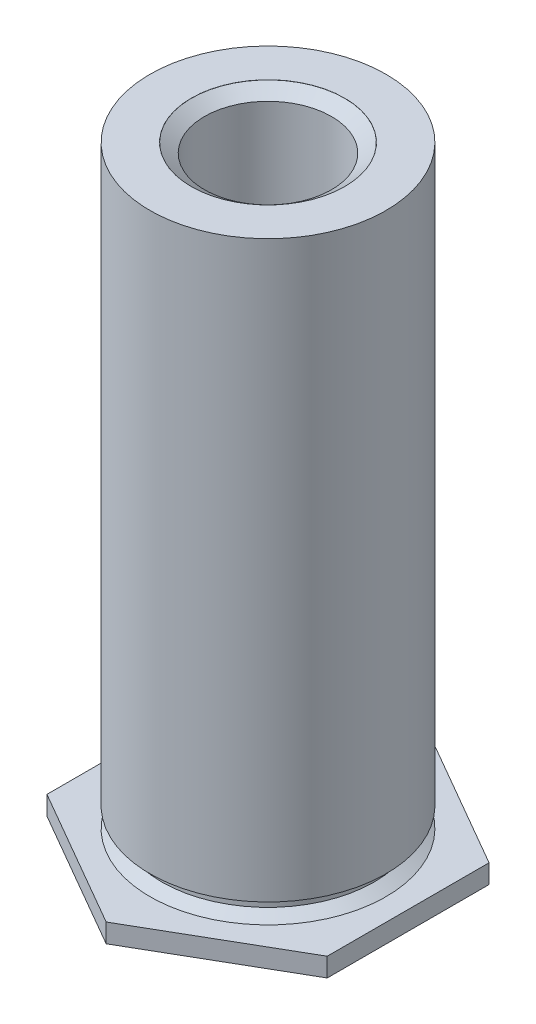
ISO-10303-21;
HEADER;
FILE_DESCRIPTION(('STEP AP214'),'2;1');
FILE_NAME('part.step','',(''),(''),'','','');
FILE_SCHEMA(('AUTOMOTIVE_DESIGN { 1 0 10303 214 1 1 1 1 }'));
ENDSEC;
DATA;
#1=APPLICATION_CONTEXT('core data for automotive mechanical design processes');
#2=APPLICATION_PROTOCOL_DEFINITION('international standard','automotive_design',2000,#1);
#3=PRODUCT_CONTEXT('',#1,'mechanical');
#4=PRODUCT('Part','Part','',(#3));
#5=PRODUCT_RELATED_PRODUCT_CATEGORY('part','',(#4));
#6=PRODUCT_DEFINITION_FORMATION('','',#4);
#7=PRODUCT_DEFINITION_CONTEXT('part definition',#1,'design');
#8=PRODUCT_DEFINITION('design','',#6,#7);
#9=PRODUCT_DEFINITION_SHAPE('','',#8);
#10=(LENGTH_UNIT() NAMED_UNIT(*) SI_UNIT(.MILLI.,.METRE.));
#11=(NAMED_UNIT(*) PLANE_ANGLE_UNIT() SI_UNIT($,.RADIAN.));
#12=(NAMED_UNIT(*) SI_UNIT($,.STERADIAN.) SOLID_ANGLE_UNIT());
#13=UNCERTAINTY_MEASURE_WITH_UNIT(LENGTH_MEASURE(1.E-05),#10,'distance_accuracy_value','');
#14=(GEOMETRIC_REPRESENTATION_CONTEXT(3) GLOBAL_UNCERTAINTY_ASSIGNED_CONTEXT((#13)) GLOBAL_UNIT_ASSIGNED_CONTEXT((#10,
#11,#12)) REPRESENTATION_CONTEXT('',''));
#15=CARTESIAN_POINT('',(0.,0.,0.));
#16=DIRECTION('',(0.,0.,1.));
#17=DIRECTION('',(1.,0.,0.));
#18=AXIS2_PLACEMENT_3D('',#15,#16,#17);
#19=CARTESIAN_POINT('',(3.712,0.4312,0.));
#20=DIRECTION('',(0.,1.,0.));
#21=DIRECTION('',(0.,0.,1.));
#22=AXIS2_PLACEMENT_3D('',#19,#20,#21);
#23=PLANE('',#22);
#24=CARTESIAN_POINT('',(0.,0.4312,0.));
#25=DIRECTION('',(0.,-1.,0.));
#26=DIRECTION('',(0.,0.,-1.));
#27=AXIS2_PLACEMENT_3D('',#24,#25,#26);
#28=CIRCLE('',#27,2.695);
#29=CARTESIAN_POINT('',(0.,0.4312,-2.695));
#30=VERTEX_POINT('',#29);
#31=EDGE_CURVE('E11',#30,#30,#28,.T.);
#32=ORIENTED_EDGE('',*,*,#31,.T.);
#33=EDGE_LOOP('',(#32));
#34=FACE_BOUND('',#33,.T.);
#35=DIRECTION('',(0.866025403784439,0.,0.5));
#36=VECTOR('',#35,1.);
#37=CARTESIAN_POINT('',(0.,0.4312,3.69504172281361));
#38=LINE('',#37,#36);
#39=CARTESIAN_POINT('',(-3.2,0.4312,1.8475208614068));
#40=VERTEX_POINT('',#39);
#41=CARTESIAN_POINT('',(0.,0.4312,3.69504172281361));
#42=VERTEX_POINT('',#41);
#43=EDGE_CURVE('E130',#40,#42,#38,.T.);
#44=ORIENTED_EDGE('',*,*,#43,.T.);
#45=DIRECTION('',(0.866025403784439,0.,-0.5));
#46=VECTOR('',#45,1.);
#47=CARTESIAN_POINT('',(3.2,0.4312,1.8475208614068));
#48=LINE('',#47,#46);
#49=CARTESIAN_POINT('',(3.2,0.4312,1.8475208614068));
#50=VERTEX_POINT('',#49);
#51=EDGE_CURVE('E119',#42,#50,#48,.T.);
#52=ORIENTED_EDGE('',*,*,#51,.T.);
#53=DIRECTION('',(0.,0.,-1.));
#54=VECTOR('',#53,1.);
#55=CARTESIAN_POINT('',(3.2,0.4312,-1.8475208614068));
#56=LINE('',#55,#54);
#57=CARTESIAN_POINT('',(3.2,0.4312,-1.8475208614068));
#58=VERTEX_POINT('',#57);
#59=EDGE_CURVE('E122',#50,#58,#56,.T.);
#60=ORIENTED_EDGE('',*,*,#59,.T.);
#61=DIRECTION('',(-0.866025403784439,0.,-0.5));
#62=VECTOR('',#61,1.);
#63=CARTESIAN_POINT('',(0.,0.4312,-3.69504172281361));
#64=LINE('',#63,#62);
#65=CARTESIAN_POINT('',(0.,0.4312,-3.69504172281361));
#66=VERTEX_POINT('',#65);
#67=EDGE_CURVE('E47',#58,#66,#64,.T.);
#68=ORIENTED_EDGE('',*,*,#67,.T.);
#69=DIRECTION('',(-0.866025403784438,0.,0.5));
#70=VECTOR('',#69,1.);
#71=CARTESIAN_POINT('',(-3.2,0.4312,-1.8475208614068));
#72=LINE('',#71,#70);
#73=CARTESIAN_POINT('',(-3.2,0.4312,-1.8475208614068));
#74=VERTEX_POINT('',#73);
#75=EDGE_CURVE('E95',#66,#74,#72,.T.);
#76=ORIENTED_EDGE('',*,*,#75,.T.);
#77=DIRECTION('',(0.,0.,1.));
#78=VECTOR('',#77,1.);
#79=CARTESIAN_POINT('',(-3.2,0.4312,1.8475208614068));
#80=LINE('',#79,#78);
#81=EDGE_CURVE('E127',#74,#40,#80,.T.);
#82=ORIENTED_EDGE('',*,*,#81,.T.);
#83=EDGE_LOOP('',(#44,#52,#60,#68,#76,#82));
#84=FACE_BOUND('',#83,.T.);
#85=ADVANCED_FACE('F32',(#34,#84),#23,.T.);
#86=CARTESIAN_POINT('',(0.,0.4312,0.));
#87=DIRECTION('',(0.,-1.,0.));
#88=DIRECTION('',(0.,0.,-1.));
#89=AXIS2_PLACEMENT_3D('',#86,#87,#88);
#90=CONICAL_SURFACE('',#89,2.695,1.0471975511966);
#91=CARTESIAN_POINT('',(0.,0.586795897546605,0.));
#92=DIRECTION('',(0.,-1.,0.));
#93=DIRECTION('',(0.,0.,-1.));
#94=AXIS2_PLACEMENT_3D('',#91,#92,#93);
#95=CIRCLE('',#94,2.4255);
#96=CARTESIAN_POINT('',(0.,0.586795897546605,-2.4255));
#97=VERTEX_POINT('',#96);
#98=EDGE_CURVE('E40',#97,#97,#95,.T.);
#99=ORIENTED_EDGE('',*,*,#98,.T.);
#100=EDGE_LOOP('',(#99));
#101=FACE_BOUND('',#100,.T.);
#102=ORIENTED_EDGE('',*,*,#31,.F.);
#103=EDGE_LOOP('',(#102));
#104=FACE_BOUND('',#103,.T.);
#105=ADVANCED_FACE('F170',(#101,#104),#90,.T.);
#106=CARTESIAN_POINT('',(0.,0.,0.));
#107=DIRECTION('',(0.,-1.,0.));
#108=DIRECTION('',(0.,0.,-1.));
#109=AXIS2_PLACEMENT_3D('',#106,#107,#108);
#110=CYLINDRICAL_SURFACE('',#109,2.4255);
#111=CARTESIAN_POINT('',(0.,0.88396,0.));
#112=DIRECTION('',(0.,-1.,0.));
#113=DIRECTION('',(0.,0.,-1.));
#114=AXIS2_PLACEMENT_3D('',#111,#112,#113);
#115=CIRCLE('',#114,2.4255);
#116=CARTESIAN_POINT('',(0.,0.88396,-2.4255));
#117=VERTEX_POINT('',#116);
#118=EDGE_CURVE('E164',#117,#117,#115,.T.);
#119=ORIENTED_EDGE('',*,*,#118,.T.);
#120=EDGE_LOOP('',(#119));
#121=FACE_BOUND('',#120,.T.);
#122=ORIENTED_EDGE('',*,*,#98,.F.);
#123=EDGE_LOOP('',(#122));
#124=FACE_BOUND('',#123,.T.);
#125=ADVANCED_FACE('F173',(#121,#124),#110,.T.);
#126=CARTESIAN_POINT('',(2.695,0.88396,0.));
#127=DIRECTION('',(0.,-1.,0.));
#128=DIRECTION('',(0.,0.,-1.));
#129=AXIS2_PLACEMENT_3D('',#126,#127,#128);
#130=PLANE('',#129);
#131=CARTESIAN_POINT('',(0.,0.88396,0.));
#132=DIRECTION('',(0.,-1.,0.));
#133=DIRECTION('',(0.,0.,-1.));
#134=AXIS2_PLACEMENT_3D('',#131,#132,#133);
#135=CIRCLE('',#134,2.695);
#136=CARTESIAN_POINT('',(0.,0.88396,-2.695));
#137=VERTEX_POINT('',#136);
#138=EDGE_CURVE('E161',#137,#137,#135,.T.);
#139=ORIENTED_EDGE('',*,*,#138,.T.);
#140=EDGE_LOOP('',(#139));
#141=FACE_BOUND('',#140,.T.);
#142=ORIENTED_EDGE('',*,*,#118,.F.);
#143=EDGE_LOOP('',(#142));
#144=FACE_BOUND('',#143,.T.);
#145=ADVANCED_FACE('F175',(#141,#144),#130,.T.);
#146=CARTESIAN_POINT('',(0.,0.,0.));
#147=DIRECTION('',(0.,-1.,0.));
#148=DIRECTION('',(0.,0.,-1.));
#149=AXIS2_PLACEMENT_3D('',#146,#147,#148);
#150=CYLINDRICAL_SURFACE('',#149,2.695);
#151=CARTESIAN_POINT('',(0.,14.,0.));
#152=DIRECTION('',(0.,-1.,0.));
#153=DIRECTION('',(0.,0.,-1.));
#154=AXIS2_PLACEMENT_3D('',#151,#152,#153);
#155=CIRCLE('',#154,2.695);
#156=CARTESIAN_POINT('',(0.,14.,-2.695));
#157=VERTEX_POINT('',#156);
#158=EDGE_CURVE('E158',#157,#157,#155,.T.);
#159=ORIENTED_EDGE('',*,*,#158,.T.);
#160=EDGE_LOOP('',(#159));
#161=FACE_BOUND('',#160,.T.);
#162=ORIENTED_EDGE('',*,*,#138,.F.);
#163=EDGE_LOOP('',(#162));
#164=FACE_BOUND('',#163,.T.);
#165=ADVANCED_FACE('F182',(#161,#164),#150,.T.);
#166=CARTESIAN_POINT('',(2.695,14.,0.));
#167=DIRECTION('',(0.,1.,0.));
#168=DIRECTION('',(0.,0.,1.));
#169=AXIS2_PLACEMENT_3D('',#166,#167,#168);
#170=PLANE('',#169);
#171=CARTESIAN_POINT('',(0.,14.,0.));
#172=DIRECTION('',(0.,1.,0.));
#173=DIRECTION('',(0.,0.,1.));
#174=AXIS2_PLACEMENT_3D('',#171,#172,#173);
#175=CIRCLE('',#174,1.7515);
#176=CARTESIAN_POINT('',(0.,14.,1.7515));
#177=VERTEX_POINT('',#176);
#178=EDGE_CURVE('E35',#177,#177,#175,.T.);
#179=ORIENTED_EDGE('',*,*,#178,.F.);
#180=EDGE_LOOP('',(#179));
#181=FACE_BOUND('',#180,.T.);
#182=ORIENTED_EDGE('',*,*,#158,.F.);
#183=EDGE_LOOP('',(#182));
#184=FACE_BOUND('',#183,.T.);
#185=ADVANCED_FACE('F229',(#181,#184),#170,.T.);
#186=CARTESIAN_POINT('',(1.7515,13.99746,0.));
#187=DIRECTION('',(0.,-1.,0.));
#188=DIRECTION('',(0.,0.,-1.));
#189=AXIS2_PLACEMENT_3D('',#186,#187,#188);
#190=PLANE('',#189);
#191=CARTESIAN_POINT('',(0.,13.99746,0.));
#192=DIRECTION('',(0.,-1.,0.));
#193=DIRECTION('',(0.,0.,-1.));
#194=AXIS2_PLACEMENT_3D('',#191,#192,#193);
#195=CIRCLE('',#194,1.7515);
#196=CARTESIAN_POINT('',(0.,13.99746,-1.7515));
#197=VERTEX_POINT('',#196);
#198=EDGE_CURVE('E135',#197,#197,#195,.T.);
#199=ORIENTED_EDGE('',*,*,#198,.F.);
#200=EDGE_LOOP('',(#199));
#201=FACE_BOUND('',#200,.T.);
#202=CARTESIAN_POINT('',(0.,13.99746,0.));
#203=DIRECTION('',(0.,-1.,0.));
#204=DIRECTION('',(0.,0.,-1.));
#205=AXIS2_PLACEMENT_3D('',#202,#203,#204);
#206=CIRCLE('',#205,1.75);
#207=CARTESIAN_POINT('',(0.,13.99746,-1.75));
#208=VERTEX_POINT('',#207);
#209=EDGE_CURVE('E146',#208,#208,#206,.T.);
#210=ORIENTED_EDGE('',*,*,#209,.T.);
#211=EDGE_LOOP('',(#210));
#212=FACE_BOUND('',#211,.T.);
#213=ADVANCED_FACE('F225',(#201,#212),#190,.F.);
#214=CARTESIAN_POINT('',(0.,13.787475760436,0.));
#215=DIRECTION('',(0.,1.,0.));
#216=DIRECTION('',(0.,0.,1.));
#217=AXIS2_PLACEMENT_3D('',#214,#215,#216);
#218=CONICAL_SURFACE('',#217,1.45,0.960105621522081);
#219=ORIENTED_EDGE('',*,*,#209,.F.);
#220=EDGE_LOOP('',(#219));
#221=FACE_BOUND('',#220,.T.);
#222=CARTESIAN_POINT('',(0.,13.787475760436,0.));
#223=DIRECTION('',(0.,-1.,0.));
#224=DIRECTION('',(0.,0.,-1.));
#225=AXIS2_PLACEMENT_3D('',#222,#223,#224);
#226=CIRCLE('',#225,1.45);
#227=CARTESIAN_POINT('',(0.,13.787475760436,-1.45));
#228=VERTEX_POINT('',#227);
#229=EDGE_CURVE('E143',#228,#228,#226,.T.);
#230=ORIENTED_EDGE('',*,*,#229,.T.);
#231=EDGE_LOOP('',(#230));
#232=FACE_BOUND('',#231,.T.);
#233=ADVANCED_FACE('F221',(#221,#232),#218,.F.);
#234=CARTESIAN_POINT('',(0.,-2.54,0.));
#235=DIRECTION('',(0.,-1.,0.));
#236=DIRECTION('',(0.,0.,-1.));
#237=AXIS2_PLACEMENT_3D('',#234,#235,#236);
#238=CYLINDRICAL_SURFACE('',#237,1.7515);
#239=ORIENTED_EDGE('',*,*,#178,.T.);
#240=EDGE_LOOP('',(#239));
#241=FACE_BOUND('',#240,.T.);
#242=ORIENTED_EDGE('',*,*,#198,.T.);
#243=EDGE_LOOP('',(#242));
#244=FACE_BOUND('',#243,.T.);
#245=ADVANCED_FACE('F217',(#241,#244),#238,.F.);
#246=CARTESIAN_POINT('',(0.,3.39939033455901,0.));
#247=DIRECTION('',(0.,1.,0.));
#248=DIRECTION('',(0.,0.,1.));
#249=AXIS2_PLACEMENT_3D('',#246,#247,#248);
#250=CONICAL_SURFACE('',#249,0.,1.17809724509617);
#251=CARTESIAN_POINT('',(0.,4.,0.));
#252=DIRECTION('',(0.,-1.,0.));
#253=DIRECTION('',(0.,0.,-1.));
#254=AXIS2_PLACEMENT_3D('',#251,#252,#253);
#255=CIRCLE('',#254,1.45);
#256=CARTESIAN_POINT('',(0.,4.,-1.45));
#257=VERTEX_POINT('',#256);
#258=EDGE_CURVE('E149',#257,#257,#255,.T.);
#259=ORIENTED_EDGE('',*,*,#258,.F.);
#260=EDGE_LOOP('',(#259));
#261=FACE_BOUND('',#260,.T.);
#262=CARTESIAN_POINT('',(0.,3.39939033455901,0.));
#263=VERTEX_POINT('',#262);
#264=VERTEX_LOOP('',#263);
#265=FACE_BOUND('',#264,.T.);
#266=ADVANCED_FACE('F220',(#261,#265),#250,.F.);
#267=CARTESIAN_POINT('',(0.,0.,0.));
#268=DIRECTION('',(0.,-1.,0.));
#269=DIRECTION('',(0.,0.,-1.));
#270=AXIS2_PLACEMENT_3D('',#267,#268,#269);
#271=CYLINDRICAL_SURFACE('',#270,1.45);
#272=ORIENTED_EDGE('',*,*,#229,.F.);
#273=EDGE_LOOP('',(#272));
#274=FACE_BOUND('',#273,.T.);
#275=ORIENTED_EDGE('',*,*,#258,.T.);
#276=EDGE_LOOP('',(#275));
#277=FACE_BOUND('',#276,.T.);
#278=ADVANCED_FACE('F216',(#274,#277),#271,.F.);
#279=CARTESIAN_POINT('',(3.2,0.,1.8475208614068));
#280=DIRECTION('',(0.5,0.,0.866025403784438));
#281=DIRECTION('',(0.866025403784439,0.,-0.5));
#282=AXIS2_PLACEMENT_3D('',#279,#280,#281);
#283=PLANE('',#282);
#284=ORIENTED_EDGE('',*,*,#51,.F.);
#285=DIRECTION('',(0.,1.,0.));
#286=VECTOR('',#285,1.);
#287=CARTESIAN_POINT('',(0.,0.,3.69504172281361));
#288=LINE('',#287,#286);
#289=CARTESIAN_POINT('',(0.,0.,3.69504172281361));
#290=VERTEX_POINT('',#289);
#291=EDGE_CURVE('E133',#290,#42,#288,.T.);
#292=ORIENTED_EDGE('',*,*,#291,.F.);
#293=DIRECTION('',(0.866025403784439,0.,-0.5));
#294=VECTOR('',#293,1.);
#295=CARTESIAN_POINT('',(3.2,0.,1.8475208614068));
#296=LINE('',#295,#294);
#297=CARTESIAN_POINT('',(3.2,0.,1.8475208614068));
#298=VERTEX_POINT('',#297);
#299=EDGE_CURVE('E55',#290,#298,#296,.T.);
#300=ORIENTED_EDGE('',*,*,#299,.T.);
#301=DIRECTION('',(0.,1.,0.));
#302=VECTOR('',#301,1.);
#303=CARTESIAN_POINT('',(3.2,0.,1.8475208614068));
#304=LINE('',#303,#302);
#305=EDGE_CURVE('E118',#298,#50,#304,.T.);
#306=ORIENTED_EDGE('',*,*,#305,.T.);
#307=EDGE_LOOP('',(#284,#292,#300,#306));
#308=FACE_BOUND('',#307,.T.);
#309=ADVANCED_FACE('F196',(#308),#283,.T.);
#310=CARTESIAN_POINT('',(0.,0.,3.69504172281361));
#311=DIRECTION('',(-0.5,0.,0.866025403784438));
#312=DIRECTION('',(0.866025403784439,0.,0.5));
#313=AXIS2_PLACEMENT_3D('',#310,#311,#312);
#314=PLANE('',#313);
#315=ORIENTED_EDGE('',*,*,#43,.F.);
#316=DIRECTION('',(0.,1.,0.));
#317=VECTOR('',#316,1.);
#318=CARTESIAN_POINT('',(-3.2,0.,1.8475208614068));
#319=LINE('',#318,#317);
#320=CARTESIAN_POINT('',(-3.2,0.,1.8475208614068));
#321=VERTEX_POINT('',#320);
#322=EDGE_CURVE('E136',#321,#40,#319,.T.);
#323=ORIENTED_EDGE('',*,*,#322,.F.);
#324=DIRECTION('',(0.866025403784439,0.,0.5));
#325=VECTOR('',#324,1.);
#326=CARTESIAN_POINT('',(0.,0.,3.69504172281361));
#327=LINE('',#326,#325);
#328=EDGE_CURVE('E112',#321,#290,#327,.T.);
#329=ORIENTED_EDGE('',*,*,#328,.T.);
#330=ORIENTED_EDGE('',*,*,#291,.T.);
#331=EDGE_LOOP('',(#315,#323,#329,#330));
#332=FACE_BOUND('',#331,.T.);
#333=ADVANCED_FACE('F195',(#332),#314,.T.);
#334=CARTESIAN_POINT('',(-3.2,0.,1.8475208614068));
#335=DIRECTION('',(-1.,0.,0.));
#336=DIRECTION('',(0.,0.,1.));
#337=AXIS2_PLACEMENT_3D('',#334,#335,#336);
#338=PLANE('',#337);
#339=ORIENTED_EDGE('',*,*,#81,.F.);
#340=DIRECTION('',(0.,1.,0.));
#341=VECTOR('',#340,1.);
#342=CARTESIAN_POINT('',(-3.2,0.,-1.8475208614068));
#343=LINE('',#342,#341);
#344=CARTESIAN_POINT('',(-3.2,0.,-1.8475208614068));
#345=VERTEX_POINT('',#344);
#346=EDGE_CURVE('E96',#345,#74,#343,.T.);
#347=ORIENTED_EDGE('',*,*,#346,.F.);
#348=DIRECTION('',(0.,0.,1.));
#349=VECTOR('',#348,1.);
#350=CARTESIAN_POINT('',(-3.2,0.,1.8475208614068));
#351=LINE('',#350,#349);
#352=EDGE_CURVE('E110',#345,#321,#351,.T.);
#353=ORIENTED_EDGE('',*,*,#352,.T.);
#354=ORIENTED_EDGE('',*,*,#322,.T.);
#355=EDGE_LOOP('',(#339,#347,#353,#354));
#356=FACE_BOUND('',#355,.T.);
#357=ADVANCED_FACE('F294',(#356),#338,.T.);
#358=CARTESIAN_POINT('',(-3.2,0.,-1.8475208614068));
#359=DIRECTION('',(-0.5,0.,-0.866025403784439));
#360=DIRECTION('',(-0.866025403784439,0.,0.5));
#361=AXIS2_PLACEMENT_3D('',#358,#359,#360);
#362=PLANE('',#361);
#363=ORIENTED_EDGE('',*,*,#75,.F.);
#364=DIRECTION('',(0.,1.,0.));
#365=VECTOR('',#364,1.);
#366=CARTESIAN_POINT('',(0.,0.,-3.69504172281361));
#367=LINE('',#366,#365);
#368=CARTESIAN_POINT('',(0.,0.,-3.69504172281361));
#369=VERTEX_POINT('',#368);
#370=EDGE_CURVE('E88',#369,#66,#367,.T.);
#371=ORIENTED_EDGE('',*,*,#370,.F.);
#372=DIRECTION('',(-0.866025403784438,0.,0.5));
#373=VECTOR('',#372,1.);
#374=CARTESIAN_POINT('',(-3.2,0.,-1.8475208614068));
#375=LINE('',#374,#373);
#376=EDGE_CURVE('E92',#369,#345,#375,.T.);
#377=ORIENTED_EDGE('',*,*,#376,.T.);
#378=ORIENTED_EDGE('',*,*,#346,.T.);
#379=EDGE_LOOP('',(#363,#371,#377,#378));
#380=FACE_BOUND('',#379,.T.);
#381=ADVANCED_FACE('F90',(#380),#362,.T.);
#382=CARTESIAN_POINT('',(0.,0.,-3.69504172281361));
#383=DIRECTION('',(0.5,0.,-0.866025403784438));
#384=DIRECTION('',(-0.866025403784439,0.,-0.5));
#385=AXIS2_PLACEMENT_3D('',#382,#383,#384);
#386=PLANE('',#385);
#387=ORIENTED_EDGE('',*,*,#67,.F.);
#388=DIRECTION('',(0.,1.,0.));
#389=VECTOR('',#388,1.);
#390=CARTESIAN_POINT('',(3.2,0.,-1.8475208614068));
#391=LINE('',#390,#389);
#392=CARTESIAN_POINT('',(3.2,0.,-1.8475208614068));
#393=VERTEX_POINT('',#392);
#394=EDGE_CURVE('E97',#393,#58,#391,.T.);
#395=ORIENTED_EDGE('',*,*,#394,.F.);
#396=DIRECTION('',(-0.866025403784439,0.,-0.5));
#397=VECTOR('',#396,1.);
#398=CARTESIAN_POINT('',(0.,0.,-3.69504172281361));
#399=LINE('',#398,#397);
#400=EDGE_CURVE('E100',#393,#369,#399,.T.);
#401=ORIENTED_EDGE('',*,*,#400,.T.);
#402=ORIENTED_EDGE('',*,*,#370,.T.);
#403=EDGE_LOOP('',(#387,#395,#401,#402));
#404=FACE_BOUND('',#403,.T.);
#405=ADVANCED_FACE('F101',(#404),#386,.T.);
#406=CARTESIAN_POINT('',(3.2,0.,-1.8475208614068));
#407=DIRECTION('',(1.,0.,0.));
#408=DIRECTION('',(0.,0.,-1.));
#409=AXIS2_PLACEMENT_3D('',#406,#407,#408);
#410=PLANE('',#409);
#411=ORIENTED_EDGE('',*,*,#59,.F.);
#412=ORIENTED_EDGE('',*,*,#305,.F.);
#413=DIRECTION('',(0.,0.,-1.));
#414=VECTOR('',#413,1.);
#415=CARTESIAN_POINT('',(3.2,0.,-1.8475208614068));
#416=LINE('',#415,#414);
#417=EDGE_CURVE('E105',#298,#393,#416,.T.);
#418=ORIENTED_EDGE('',*,*,#417,.T.);
#419=ORIENTED_EDGE('',*,*,#394,.T.);
#420=EDGE_LOOP('',(#411,#412,#418,#419));
#421=FACE_BOUND('',#420,.T.);
#422=ADVANCED_FACE('F199',(#421),#410,.T.);
#423=CARTESIAN_POINT('',(2.695,0.00253999999999978,0.));
#424=DIRECTION('',(0.,-1.,0.));
#425=DIRECTION('',(0.,0.,-1.));
#426=AXIS2_PLACEMENT_3D('',#423,#424,#425);
#427=PLANE('',#426);
#428=CARTESIAN_POINT('',(0.,0.00254,0.));
#429=DIRECTION('',(0.,-1.,0.));
#430=DIRECTION('',(0.,0.,-1.));
#431=AXIS2_PLACEMENT_3D('',#428,#429,#430);
#432=CIRCLE('',#431,2.695);
#433=CARTESIAN_POINT('',(0.,0.00254,-2.695));
#434=VERTEX_POINT('',#433);
#435=EDGE_CURVE('E155',#434,#434,#432,.T.);
#436=ORIENTED_EDGE('',*,*,#435,.T.);
#437=EDGE_LOOP('',(#436));
#438=FACE_BOUND('',#437,.T.);
#439=ADVANCED_FACE('F202',(#438),#427,.T.);
#440=CARTESIAN_POINT('',(0.,0.,0.));
#441=DIRECTION('',(0.,-1.,0.));
#442=DIRECTION('',(0.,0.,-1.));
#443=AXIS2_PLACEMENT_3D('',#440,#441,#442);
#444=CYLINDRICAL_SURFACE('',#443,2.695);
#445=CARTESIAN_POINT('',(0.,0.,0.));
#446=DIRECTION('',(0.,-1.,0.));
#447=DIRECTION('',(0.,0.,-1.));
#448=AXIS2_PLACEMENT_3D('',#445,#446,#447);
#449=CIRCLE('',#448,2.695);
#450=CARTESIAN_POINT('',(0.,0.,-2.695));
#451=VERTEX_POINT('',#450);
#452=EDGE_CURVE('E152',#451,#451,#449,.T.);
#453=ORIENTED_EDGE('',*,*,#452,.T.);
#454=EDGE_LOOP('',(#453));
#455=FACE_BOUND('',#454,.T.);
#456=ORIENTED_EDGE('',*,*,#435,.F.);
#457=EDGE_LOOP('',(#456));
#458=FACE_BOUND('',#457,.T.);
#459=ADVANCED_FACE('F208',(#455,#458),#444,.F.);
#460=CARTESIAN_POINT('',(2.695,0.,0.));
#461=DIRECTION('',(0.,-1.,0.));
#462=DIRECTION('',(0.,0.,-1.));
#463=AXIS2_PLACEMENT_3D('',#460,#461,#462);
#464=PLANE('',#463);
#465=ORIENTED_EDGE('',*,*,#452,.F.);
#466=EDGE_LOOP('',(#465));
#467=FACE_BOUND('',#466,.T.);
#468=ORIENTED_EDGE('',*,*,#417,.F.);
#469=ORIENTED_EDGE('',*,*,#299,.F.);
#470=ORIENTED_EDGE('',*,*,#328,.F.);
#471=ORIENTED_EDGE('',*,*,#352,.F.);
#472=ORIENTED_EDGE('',*,*,#376,.F.);
#473=ORIENTED_EDGE('',*,*,#400,.F.);
#474=EDGE_LOOP('',(#468,#469,#470,#471,#472,#473));
#475=FACE_BOUND('',#474,.T.);
#476=ADVANCED_FACE('F107',(#467,#475),#464,.T.);
#477=CLOSED_SHELL('',(#85,#105,#125,#145,#165,#185,#213,#233,#245,#266,#278,#309,#333,#357,#381,
#405,#422,#439,#459,#476));
#478=MANIFOLD_SOLID_BREP('B2',#477);
#479=ADVANCED_BREP_SHAPE_REPRESENTATION('',(#18,#478),#14);
#480=SHAPE_DEFINITION_REPRESENTATION(#9,#479);
ENDSEC;
END-ISO-10303-21;
